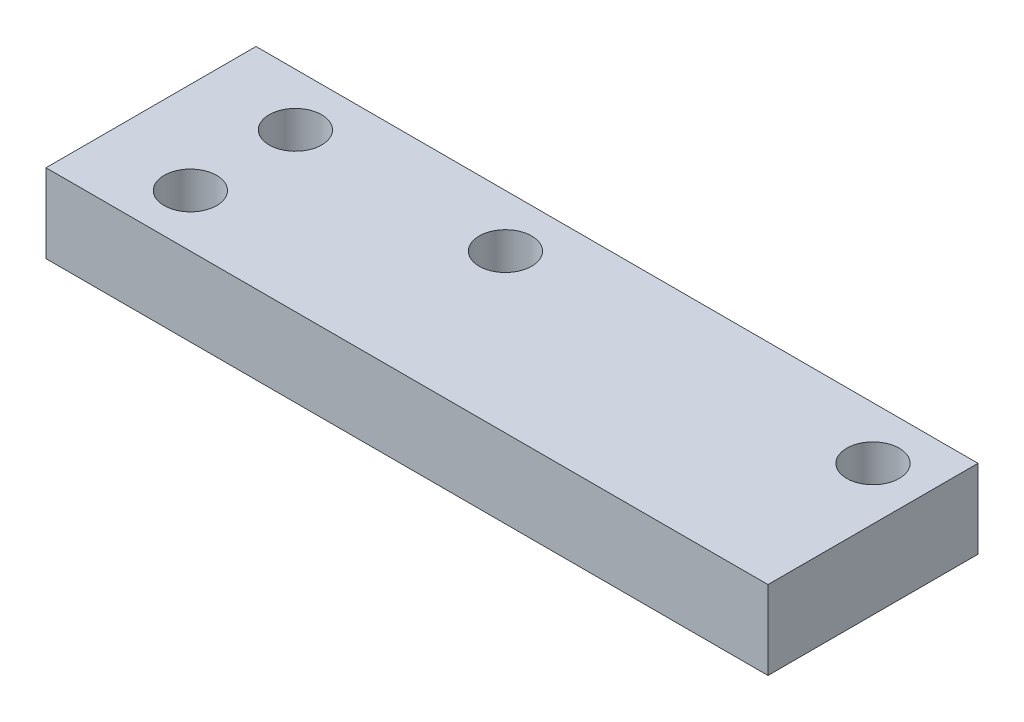
ISO-10303-21;
HEADER;
FILE_DESCRIPTION(('STEP AP214'),'2;1');
FILE_NAME('part.step','',(''),(''),'','','');
FILE_SCHEMA(('AUTOMOTIVE_DESIGN { 1 0 10303 214 1 1 1 1 }'));
ENDSEC;
DATA;
#1=APPLICATION_CONTEXT('core data for automotive mechanical design processes');
#2=APPLICATION_PROTOCOL_DEFINITION('international standard','automotive_design',2000,#1);
#3=PRODUCT_CONTEXT('',#1,'mechanical');
#4=PRODUCT('Part','Part','',(#3));
#5=PRODUCT_RELATED_PRODUCT_CATEGORY('part','',(#4));
#6=PRODUCT_DEFINITION_FORMATION('','',#4);
#7=PRODUCT_DEFINITION_CONTEXT('part definition',#1,'design');
#8=PRODUCT_DEFINITION('design','',#6,#7);
#9=PRODUCT_DEFINITION_SHAPE('','',#8);
#10=(LENGTH_UNIT() NAMED_UNIT(*) SI_UNIT(.MILLI.,.METRE.));
#11=(NAMED_UNIT(*) PLANE_ANGLE_UNIT() SI_UNIT($,.RADIAN.));
#12=(NAMED_UNIT(*) SI_UNIT($,.STERADIAN.) SOLID_ANGLE_UNIT());
#13=UNCERTAINTY_MEASURE_WITH_UNIT(LENGTH_MEASURE(1.E-05),#10,'distance_accuracy_value','');
#14=(GEOMETRIC_REPRESENTATION_CONTEXT(3) GLOBAL_UNCERTAINTY_ASSIGNED_CONTEXT((#13)) GLOBAL_UNIT_ASSIGNED_CONTEXT((#10,
#11,#12)) REPRESENTATION_CONTEXT('',''));
#15=CARTESIAN_POINT('',(0.,0.,0.));
#16=DIRECTION('',(0.,0.,1.));
#17=DIRECTION('',(1.,0.,0.));
#18=AXIS2_PLACEMENT_3D('',#15,#16,#17);
#19=CARTESIAN_POINT('',(0.,6.,0.));
#20=DIRECTION('',(0.,1.,0.));
#21=DIRECTION('',(0.,0.,1.));
#22=AXIS2_PLACEMENT_3D('',#19,#20,#21);
#23=PLANE('',#22);
#24=CARTESIAN_POINT('',(7.,6.,4.));
#25=DIRECTION('',(0.,1.,0.));
#26=DIRECTION('',(0.,0.,1.));
#27=AXIS2_PLACEMENT_3D('',#24,#25,#26);
#28=CIRCLE('',#27,2.);
#29=CARTESIAN_POINT('',(7.,6.,6.));
#30=VERTEX_POINT('',#29);
#31=EDGE_CURVE('E142',#30,#30,#28,.T.);
#32=ORIENTED_EDGE('',*,*,#31,.F.);
#33=EDGE_LOOP('',(#32));
#34=FACE_BOUND('',#33,.T.);
#35=CARTESIAN_POINT('',(23.,6.,4.));
#36=DIRECTION('',(0.,1.,0.));
#37=DIRECTION('',(0.,0.,1.));
#38=AXIS2_PLACEMENT_3D('',#35,#36,#37);
#39=CIRCLE('',#38,2.);
#40=CARTESIAN_POINT('',(23.,6.,6.));
#41=VERTEX_POINT('',#40);
#42=EDGE_CURVE('E112',#41,#41,#39,.T.);
#43=ORIENTED_EDGE('',*,*,#42,.F.);
#44=EDGE_LOOP('',(#43));
#45=FACE_BOUND('',#44,.T.);
#46=DIRECTION('',(0.,0.,1.));
#47=VECTOR('',#46,1.);
#48=CARTESIAN_POINT('',(0.,6.,0.));
#49=LINE('',#48,#47);
#50=CARTESIAN_POINT('',(0.,6.,0.));
#51=VERTEX_POINT('',#50);
#52=CARTESIAN_POINT('',(0.,6.,16.));
#53=VERTEX_POINT('',#52);
#54=EDGE_CURVE('E92',#51,#53,#49,.T.);
#55=ORIENTED_EDGE('',*,*,#54,.T.);
#56=DIRECTION('',(1.,0.,0.));
#57=VECTOR('',#56,1.);
#58=CARTESIAN_POINT('',(0.,6.,16.));
#59=LINE('',#58,#57);
#60=CARTESIAN_POINT('',(55.,6.,16.));
#61=VERTEX_POINT('',#60);
#62=EDGE_CURVE('E87',#53,#61,#59,.T.);
#63=ORIENTED_EDGE('',*,*,#62,.T.);
#64=DIRECTION('',(0.,0.,-1.));
#65=VECTOR('',#64,1.);
#66=CARTESIAN_POINT('',(55.,6.,0.));
#67=LINE('',#66,#65);
#68=CARTESIAN_POINT('',(55.,6.,0.));
#69=VERTEX_POINT('',#68);
#70=EDGE_CURVE('E90',#61,#69,#67,.T.);
#71=ORIENTED_EDGE('',*,*,#70,.T.);
#72=DIRECTION('',(-1.,0.,0.));
#73=VECTOR('',#72,1.);
#74=CARTESIAN_POINT('',(0.,6.,0.));
#75=LINE('',#74,#73);
#76=EDGE_CURVE('E57',#69,#51,#75,.T.);
#77=ORIENTED_EDGE('',*,*,#76,.T.);
#78=EDGE_LOOP('',(#55,#63,#71,#77));
#79=FACE_BOUND('',#78,.T.);
#80=CARTESIAN_POINT('',(51.,6.,4.));
#81=DIRECTION('',(0.,1.,0.));
#82=DIRECTION('',(0.,0.,1.));
#83=AXIS2_PLACEMENT_3D('',#80,#81,#82);
#84=CIRCLE('',#83,2.);
#85=CARTESIAN_POINT('',(51.,6.,6.));
#86=VERTEX_POINT('',#85);
#87=EDGE_CURVE('E134',#86,#86,#84,.T.);
#88=ORIENTED_EDGE('',*,*,#87,.F.);
#89=EDGE_LOOP('',(#88));
#90=FACE_BOUND('',#89,.T.);
#91=CARTESIAN_POINT('',(7.,6.,12.));
#92=DIRECTION('',(0.,1.,0.));
#93=DIRECTION('',(0.,0.,1.));
#94=AXIS2_PLACEMENT_3D('',#91,#92,#93);
#95=CIRCLE('',#94,2.);
#96=CARTESIAN_POINT('',(7.,6.,14.));
#97=VERTEX_POINT('',#96);
#98=EDGE_CURVE('E150',#97,#97,#95,.T.);
#99=ORIENTED_EDGE('',*,*,#98,.F.);
#100=EDGE_LOOP('',(#99));
#101=FACE_BOUND('',#100,.T.);
#102=ADVANCED_FACE('F39',(#34,#45,#79,#90,#101),#23,.T.);
#103=CARTESIAN_POINT('',(0.,0.,0.));
#104=DIRECTION('',(0.,1.,0.));
#105=DIRECTION('',(0.,0.,1.));
#106=AXIS2_PLACEMENT_3D('',#103,#104,#105);
#107=PLANE('',#106);
#108=DIRECTION('',(0.,0.,1.));
#109=VECTOR('',#108,1.);
#110=CARTESIAN_POINT('',(0.,0.,0.));
#111=LINE('',#110,#109);
#112=CARTESIAN_POINT('',(0.,0.,0.));
#113=VERTEX_POINT('',#112);
#114=CARTESIAN_POINT('',(0.,0.,16.));
#115=VERTEX_POINT('',#114);
#116=EDGE_CURVE('E108',#113,#115,#111,.T.);
#117=ORIENTED_EDGE('',*,*,#116,.F.);
#118=DIRECTION('',(-1.,0.,0.));
#119=VECTOR('',#118,1.);
#120=CARTESIAN_POINT('',(0.,0.,0.));
#121=LINE('',#120,#119);
#122=CARTESIAN_POINT('',(55.,0.,0.));
#123=VERTEX_POINT('',#122);
#124=EDGE_CURVE('E80',#123,#113,#121,.T.);
#125=ORIENTED_EDGE('',*,*,#124,.F.);
#126=DIRECTION('',(0.,0.,-1.));
#127=VECTOR('',#126,1.);
#128=CARTESIAN_POINT('',(55.,0.,0.));
#129=LINE('',#128,#127);
#130=CARTESIAN_POINT('',(55.,0.,16.));
#131=VERTEX_POINT('',#130);
#132=EDGE_CURVE('E74',#131,#123,#129,.T.);
#133=ORIENTED_EDGE('',*,*,#132,.F.);
#134=DIRECTION('',(1.,0.,0.));
#135=VECTOR('',#134,1.);
#136=CARTESIAN_POINT('',(0.,0.,16.));
#137=LINE('',#136,#135);
#138=EDGE_CURVE('E97',#115,#131,#137,.T.);
#139=ORIENTED_EDGE('',*,*,#138,.F.);
#140=EDGE_LOOP('',(#117,#125,#133,#139));
#141=FACE_BOUND('',#140,.T.);
#142=CARTESIAN_POINT('',(23.,0.,4.));
#143=DIRECTION('',(0.,1.,0.));
#144=DIRECTION('',(0.,0.,1.));
#145=AXIS2_PLACEMENT_3D('',#142,#143,#144);
#146=CIRCLE('',#145,2.);
#147=CARTESIAN_POINT('',(23.,0.,6.));
#148=VERTEX_POINT('',#147);
#149=EDGE_CURVE('E130',#148,#148,#146,.T.);
#150=ORIENTED_EDGE('',*,*,#149,.T.);
#151=EDGE_LOOP('',(#150));
#152=FACE_BOUND('',#151,.T.);
#153=CARTESIAN_POINT('',(51.,0.,4.));
#154=DIRECTION('',(0.,1.,0.));
#155=DIRECTION('',(0.,0.,1.));
#156=AXIS2_PLACEMENT_3D('',#153,#154,#155);
#157=CIRCLE('',#156,2.);
#158=CARTESIAN_POINT('',(51.,0.,6.));
#159=VERTEX_POINT('',#158);
#160=EDGE_CURVE('E138',#159,#159,#157,.T.);
#161=ORIENTED_EDGE('',*,*,#160,.T.);
#162=EDGE_LOOP('',(#161));
#163=FACE_BOUND('',#162,.T.);
#164=CARTESIAN_POINT('',(7.,0.,4.));
#165=DIRECTION('',(0.,1.,0.));
#166=DIRECTION('',(0.,0.,1.));
#167=AXIS2_PLACEMENT_3D('',#164,#165,#166);
#168=CIRCLE('',#167,2.);
#169=CARTESIAN_POINT('',(7.,0.,6.));
#170=VERTEX_POINT('',#169);
#171=EDGE_CURVE('E146',#170,#170,#168,.T.);
#172=ORIENTED_EDGE('',*,*,#171,.T.);
#173=EDGE_LOOP('',(#172));
#174=FACE_BOUND('',#173,.T.);
#175=CARTESIAN_POINT('',(7.,0.,12.));
#176=DIRECTION('',(0.,1.,0.));
#177=DIRECTION('',(0.,0.,1.));
#178=AXIS2_PLACEMENT_3D('',#175,#176,#177);
#179=CIRCLE('',#178,2.);
#180=CARTESIAN_POINT('',(7.,0.,14.));
#181=VERTEX_POINT('',#180);
#182=EDGE_CURVE('E154',#181,#181,#179,.T.);
#183=ORIENTED_EDGE('',*,*,#182,.T.);
#184=EDGE_LOOP('',(#183));
#185=FACE_BOUND('',#184,.T.);
#186=ADVANCED_FACE('F125',(#141,#152,#163,#174,#185),#107,.F.);
#187=CARTESIAN_POINT('',(0.,6.,0.));
#188=DIRECTION('',(1.,0.,0.));
#189=DIRECTION('',(0.,0.,-1.));
#190=AXIS2_PLACEMENT_3D('',#187,#188,#189);
#191=PLANE('',#190);
#192=ORIENTED_EDGE('',*,*,#116,.T.);
#193=DIRECTION('',(0.,-1.,0.));
#194=VECTOR('',#193,1.);
#195=CARTESIAN_POINT('',(0.,6.,16.));
#196=LINE('',#195,#194);
#197=EDGE_CURVE('E11',#53,#115,#196,.T.);
#198=ORIENTED_EDGE('',*,*,#197,.F.);
#199=ORIENTED_EDGE('',*,*,#54,.F.);
#200=DIRECTION('',(0.,-1.,0.));
#201=VECTOR('',#200,1.);
#202=CARTESIAN_POINT('',(0.,6.,0.));
#203=LINE('',#202,#201);
#204=EDGE_CURVE('E104',#51,#113,#203,.T.);
#205=ORIENTED_EDGE('',*,*,#204,.T.);
#206=EDGE_LOOP('',(#192,#198,#199,#205));
#207=FACE_BOUND('',#206,.T.);
#208=ADVANCED_FACE('F41',(#207),#191,.F.);
#209=CARTESIAN_POINT('',(0.,6.,16.));
#210=DIRECTION('',(0.,0.,-1.));
#211=DIRECTION('',(-1.,0.,0.));
#212=AXIS2_PLACEMENT_3D('',#209,#210,#211);
#213=PLANE('',#212);
#214=ORIENTED_EDGE('',*,*,#138,.T.);
#215=DIRECTION('',(0.,-1.,0.));
#216=VECTOR('',#215,1.);
#217=CARTESIAN_POINT('',(55.,6.,16.));
#218=LINE('',#217,#216);
#219=EDGE_CURVE('E49',#61,#131,#218,.T.);
#220=ORIENTED_EDGE('',*,*,#219,.F.);
#221=ORIENTED_EDGE('',*,*,#62,.F.);
#222=ORIENTED_EDGE('',*,*,#197,.T.);
#223=EDGE_LOOP('',(#214,#220,#221,#222));
#224=FACE_BOUND('',#223,.T.);
#225=ADVANCED_FACE('F96',(#224),#213,.F.);
#226=CARTESIAN_POINT('',(55.,6.,0.));
#227=DIRECTION('',(-1.,0.,0.));
#228=DIRECTION('',(0.,0.,1.));
#229=AXIS2_PLACEMENT_3D('',#226,#227,#228);
#230=PLANE('',#229);
#231=ORIENTED_EDGE('',*,*,#132,.T.);
#232=DIRECTION('',(0.,-1.,0.));
#233=VECTOR('',#232,1.);
#234=CARTESIAN_POINT('',(55.,6.,0.));
#235=LINE('',#234,#233);
#236=EDGE_CURVE('E99',#69,#123,#235,.T.);
#237=ORIENTED_EDGE('',*,*,#236,.F.);
#238=ORIENTED_EDGE('',*,*,#70,.F.);
#239=ORIENTED_EDGE('',*,*,#219,.T.);
#240=EDGE_LOOP('',(#231,#237,#238,#239));
#241=FACE_BOUND('',#240,.T.);
#242=ADVANCED_FACE('F100',(#241),#230,.F.);
#243=CARTESIAN_POINT('',(0.,6.,0.));
#244=DIRECTION('',(0.,0.,1.));
#245=DIRECTION('',(1.,0.,0.));
#246=AXIS2_PLACEMENT_3D('',#243,#244,#245);
#247=PLANE('',#246);
#248=ORIENTED_EDGE('',*,*,#124,.T.);
#249=ORIENTED_EDGE('',*,*,#204,.F.);
#250=ORIENTED_EDGE('',*,*,#76,.F.);
#251=ORIENTED_EDGE('',*,*,#236,.T.);
#252=EDGE_LOOP('',(#248,#249,#250,#251));
#253=FACE_BOUND('',#252,.T.);
#254=ADVANCED_FACE('F122',(#253),#247,.F.);
#255=CARTESIAN_POINT('',(23.,6.,4.));
#256=DIRECTION('',(0.,-1.,0.));
#257=DIRECTION('',(0.,0.,-1.));
#258=AXIS2_PLACEMENT_3D('',#255,#256,#257);
#259=CYLINDRICAL_SURFACE('',#258,2.);
#260=ORIENTED_EDGE('',*,*,#42,.T.);
#261=EDGE_LOOP('',(#260));
#262=FACE_BOUND('',#261,.T.);
#263=ORIENTED_EDGE('',*,*,#149,.F.);
#264=EDGE_LOOP('',(#263));
#265=FACE_BOUND('',#264,.T.);
#266=ADVANCED_FACE('F175',(#262,#265),#259,.F.);
#267=CARTESIAN_POINT('',(51.,6.,4.));
#268=DIRECTION('',(0.,-1.,0.));
#269=DIRECTION('',(0.,0.,-1.));
#270=AXIS2_PLACEMENT_3D('',#267,#268,#269);
#271=CYLINDRICAL_SURFACE('',#270,2.);
#272=ORIENTED_EDGE('',*,*,#87,.T.);
#273=EDGE_LOOP('',(#272));
#274=FACE_BOUND('',#273,.T.);
#275=ORIENTED_EDGE('',*,*,#160,.F.);
#276=EDGE_LOOP('',(#275));
#277=FACE_BOUND('',#276,.T.);
#278=ADVANCED_FACE('F221',(#274,#277),#271,.F.);
#279=CARTESIAN_POINT('',(7.,6.,4.));
#280=DIRECTION('',(0.,-1.,0.));
#281=DIRECTION('',(0.,0.,-1.));
#282=AXIS2_PLACEMENT_3D('',#279,#280,#281);
#283=CYLINDRICAL_SURFACE('',#282,2.);
#284=ORIENTED_EDGE('',*,*,#31,.T.);
#285=EDGE_LOOP('',(#284));
#286=FACE_BOUND('',#285,.T.);
#287=ORIENTED_EDGE('',*,*,#171,.F.);
#288=EDGE_LOOP('',(#287));
#289=FACE_BOUND('',#288,.T.);
#290=ADVANCED_FACE('F229',(#286,#289),#283,.F.);
#291=CARTESIAN_POINT('',(7.,6.,12.));
#292=DIRECTION('',(0.,-1.,0.));
#293=DIRECTION('',(0.,0.,-1.));
#294=AXIS2_PLACEMENT_3D('',#291,#292,#293);
#295=CYLINDRICAL_SURFACE('',#294,2.);
#296=ORIENTED_EDGE('',*,*,#98,.T.);
#297=EDGE_LOOP('',(#296));
#298=FACE_BOUND('',#297,.T.);
#299=ORIENTED_EDGE('',*,*,#182,.F.);
#300=EDGE_LOOP('',(#299));
#301=FACE_BOUND('',#300,.T.);
#302=ADVANCED_FACE('F162',(#298,#301),#295,.F.);
#303=CLOSED_SHELL('',(#102,#186,#208,#225,#242,#254,#266,#278,#290,#302));
#304=MANIFOLD_SOLID_BREP('B2',#303);
#305=ADVANCED_BREP_SHAPE_REPRESENTATION('',(#18,#304),#14);
#306=SHAPE_DEFINITION_REPRESENTATION(#9,#305);
ENDSEC;
END-ISO-10303-21;
